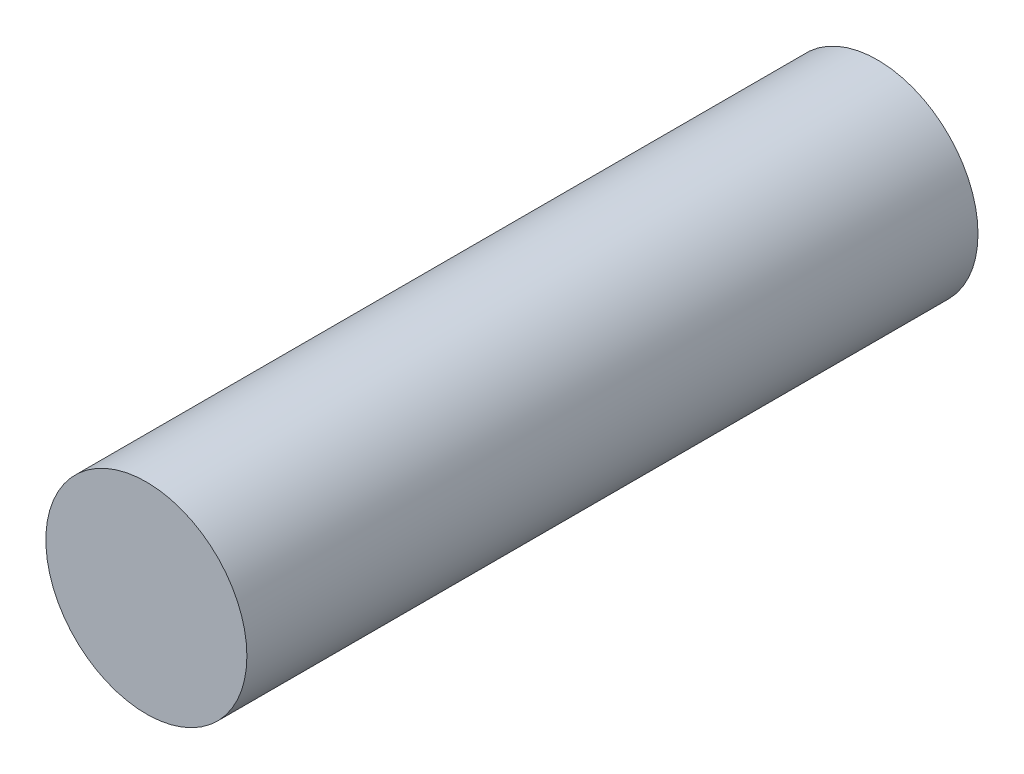
ISO-10303-21;
HEADER;
FILE_DESCRIPTION(('STEP AP214'),'2;1');
FILE_NAME('part.step','',(''),(''),'','','');
FILE_SCHEMA(('AUTOMOTIVE_DESIGN { 1 0 10303 214 1 1 1 1 }'));
ENDSEC;
DATA;
#1=APPLICATION_CONTEXT('core data for automotive mechanical design processes');
#2=APPLICATION_PROTOCOL_DEFINITION('international standard','automotive_design',2000,#1);
#3=PRODUCT_CONTEXT('',#1,'mechanical');
#4=PRODUCT('Part','Part','',(#3));
#5=PRODUCT_RELATED_PRODUCT_CATEGORY('part','',(#4));
#6=PRODUCT_DEFINITION_FORMATION('','',#4);
#7=PRODUCT_DEFINITION_CONTEXT('part definition',#1,'design');
#8=PRODUCT_DEFINITION('design','',#6,#7);
#9=PRODUCT_DEFINITION_SHAPE('','',#8);
#10=(LENGTH_UNIT() NAMED_UNIT(*) SI_UNIT(.MILLI.,.METRE.));
#11=(NAMED_UNIT(*) PLANE_ANGLE_UNIT() SI_UNIT($,.RADIAN.));
#12=(NAMED_UNIT(*) SI_UNIT($,.STERADIAN.) SOLID_ANGLE_UNIT());
#13=UNCERTAINTY_MEASURE_WITH_UNIT(LENGTH_MEASURE(1.E-05),#10,'distance_accuracy_value','');
#14=(GEOMETRIC_REPRESENTATION_CONTEXT(3) GLOBAL_UNCERTAINTY_ASSIGNED_CONTEXT((#13)) GLOBAL_UNIT_ASSIGNED_CONTEXT((#10,
#11,#12)) REPRESENTATION_CONTEXT('',''));
#15=CARTESIAN_POINT('',(0.,0.,0.));
#16=DIRECTION('',(0.,0.,1.));
#17=DIRECTION('',(1.,0.,0.));
#18=AXIS2_PLACEMENT_3D('',#15,#16,#17);
#19=CARTESIAN_POINT('',(0.,0.,508.));
#20=DIRECTION('',(0.,0.,-1.));
#21=DIRECTION('',(-1.,0.,0.));
#22=AXIS2_PLACEMENT_3D('',#19,#20,#21);
#23=CYLINDRICAL_SURFACE('',#22,69.85);
#24=CARTESIAN_POINT('',(0.,0.,508.));
#25=DIRECTION('',(0.,0.,1.));
#26=DIRECTION('',(1.,0.,0.));
#27=AXIS2_PLACEMENT_3D('',#24,#25,#26);
#28=CIRCLE('',#27,69.85);
#29=CARTESIAN_POINT('',(69.85,0.,508.));
#30=VERTEX_POINT('',#29);
#31=EDGE_CURVE('E10',#30,#30,#28,.T.);
#32=ORIENTED_EDGE('',*,*,#31,.F.);
#33=EDGE_LOOP('',(#32));
#34=FACE_BOUND('',#33,.T.);
#35=CARTESIAN_POINT('',(0.,0.,0.));
#36=DIRECTION('',(0.,0.,1.));
#37=DIRECTION('',(1.,0.,0.));
#38=AXIS2_PLACEMENT_3D('',#35,#36,#37);
#39=CIRCLE('',#38,69.85);
#40=CARTESIAN_POINT('',(69.85,0.,0.));
#41=VERTEX_POINT('',#40);
#42=EDGE_CURVE('E34',#41,#41,#39,.T.);
#43=ORIENTED_EDGE('',*,*,#42,.T.);
#44=EDGE_LOOP('',(#43));
#45=FACE_BOUND('',#44,.T.);
#46=ADVANCED_FACE('F31',(#34,#45),#23,.T.);
#47=CARTESIAN_POINT('',(0.,0.,508.));
#48=DIRECTION('',(0.,0.,1.));
#49=DIRECTION('',(1.,0.,0.));
#50=AXIS2_PLACEMENT_3D('',#47,#48,#49);
#51=PLANE('',#50);
#52=ORIENTED_EDGE('',*,*,#31,.T.);
#53=EDGE_LOOP('',(#52));
#54=FACE_BOUND('',#53,.T.);
#55=ADVANCED_FACE('F46',(#54),#51,.T.);
#56=CARTESIAN_POINT('',(0.,0.,0.));
#57=DIRECTION('',(0.,0.,1.));
#58=DIRECTION('',(1.,0.,0.));
#59=AXIS2_PLACEMENT_3D('',#56,#57,#58);
#60=PLANE('',#59);
#61=ORIENTED_EDGE('',*,*,#42,.F.);
#62=EDGE_LOOP('',(#61));
#63=FACE_BOUND('',#62,.T.);
#64=ADVANCED_FACE('F44',(#63),#60,.F.);
#65=CLOSED_SHELL('',(#46,#55,#64));
#66=MANIFOLD_SOLID_BREP('B2',#65);
#67=ADVANCED_BREP_SHAPE_REPRESENTATION('',(#18,#66),#14);
#68=SHAPE_DEFINITION_REPRESENTATION(#9,#67);
ENDSEC;
END-ISO-10303-21;
